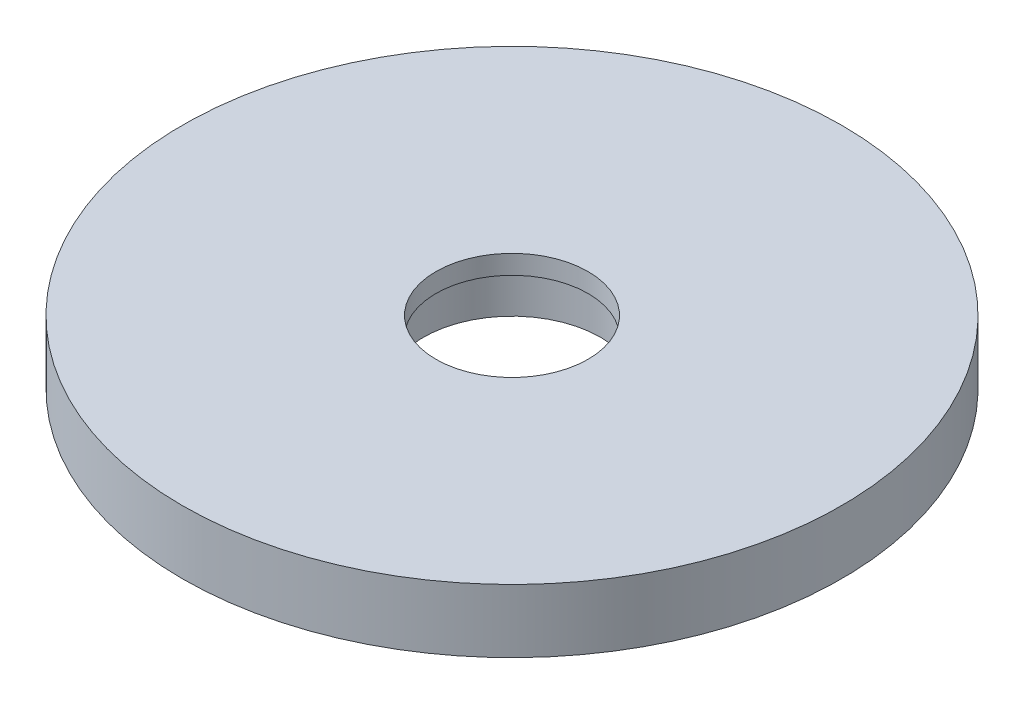
ISO-10303-21;
HEADER;
FILE_DESCRIPTION(('STEP AP214'),'2;1');
FILE_NAME('part.step','',(''),(''),'','','');
FILE_SCHEMA(('AUTOMOTIVE_DESIGN { 1 0 10303 214 1 1 1 1 }'));
ENDSEC;
DATA;
#1=APPLICATION_CONTEXT('core data for automotive mechanical design processes');
#2=APPLICATION_PROTOCOL_DEFINITION('international standard','automotive_design',2000,#1);
#3=PRODUCT_CONTEXT('',#1,'mechanical');
#4=PRODUCT('Part','Part','',(#3));
#5=PRODUCT_RELATED_PRODUCT_CATEGORY('part','',(#4));
#6=PRODUCT_DEFINITION_FORMATION('','',#4);
#7=PRODUCT_DEFINITION_CONTEXT('part definition',#1,'design');
#8=PRODUCT_DEFINITION('design','',#6,#7);
#9=PRODUCT_DEFINITION_SHAPE('','',#8);
#10=(LENGTH_UNIT() NAMED_UNIT(*) SI_UNIT(.MILLI.,.METRE.));
#11=(NAMED_UNIT(*) PLANE_ANGLE_UNIT() SI_UNIT($,.RADIAN.));
#12=(NAMED_UNIT(*) SI_UNIT($,.STERADIAN.) SOLID_ANGLE_UNIT());
#13=UNCERTAINTY_MEASURE_WITH_UNIT(LENGTH_MEASURE(1.E-05),#10,'distance_accuracy_value','');
#14=(GEOMETRIC_REPRESENTATION_CONTEXT(3) GLOBAL_UNCERTAINTY_ASSIGNED_CONTEXT((#13)) GLOBAL_UNIT_ASSIGNED_CONTEXT((#10,
#11,#12)) REPRESENTATION_CONTEXT('',''));
#15=CARTESIAN_POINT('',(0.,0.,0.));
#16=DIRECTION('',(0.,0.,1.));
#17=DIRECTION('',(1.,0.,0.));
#18=AXIS2_PLACEMENT_3D('',#15,#16,#17);
#19=CARTESIAN_POINT('',(0.,10.,0.));
#20=DIRECTION('',(0.,-1.,0.));
#21=DIRECTION('',(0.,0.,-1.));
#22=AXIS2_PLACEMENT_3D('',#19,#20,#21);
#23=CYLINDRICAL_SURFACE('',#22,12.);
#24=CARTESIAN_POINT('',(0.,10.,0.));
#25=DIRECTION('',(0.,1.,0.));
#26=DIRECTION('',(0.,0.,1.));
#27=AXIS2_PLACEMENT_3D('',#24,#25,#26);
#28=CIRCLE('',#27,12.);
#29=CARTESIAN_POINT('',(0.,10.,12.));
#30=VERTEX_POINT('',#29);
#31=EDGE_CURVE('E55',#30,#30,#28,.T.);
#32=ORIENTED_EDGE('',*,*,#31,.T.);
#33=EDGE_LOOP('',(#32));
#34=FACE_BOUND('',#33,.T.);
#35=CARTESIAN_POINT('',(0.,7.,0.));
#36=DIRECTION('',(0.,-1.,0.));
#37=DIRECTION('',(0.,0.,-1.));
#38=AXIS2_PLACEMENT_3D('',#35,#36,#37);
#39=CIRCLE('',#38,12.);
#40=CARTESIAN_POINT('',(0.,7.,-12.));
#41=VERTEX_POINT('',#40);
#42=EDGE_CURVE('E38',#41,#41,#39,.T.);
#43=ORIENTED_EDGE('',*,*,#42,.T.);
#44=EDGE_LOOP('',(#43));
#45=FACE_BOUND('',#44,.T.);
#46=ADVANCED_FACE('F34',(#34,#45),#23,.F.);
#47=CARTESIAN_POINT('',(0.,10.,0.));
#48=DIRECTION('',(0.,-1.,0.));
#49=DIRECTION('',(0.,0.,-1.));
#50=AXIS2_PLACEMENT_3D('',#47,#48,#49);
#51=CYLINDRICAL_SURFACE('',#50,52.);
#52=CARTESIAN_POINT('',(0.,10.,0.));
#53=DIRECTION('',(0.,1.,0.));
#54=DIRECTION('',(0.,0.,1.));
#55=AXIS2_PLACEMENT_3D('',#52,#53,#54);
#56=CIRCLE('',#55,52.);
#57=CARTESIAN_POINT('',(0.,10.,52.));
#58=VERTEX_POINT('',#57);
#59=EDGE_CURVE('E42',#58,#58,#56,.T.);
#60=ORIENTED_EDGE('',*,*,#59,.F.);
#61=EDGE_LOOP('',(#60));
#62=FACE_BOUND('',#61,.T.);
#63=CARTESIAN_POINT('',(0.,0.,0.));
#64=DIRECTION('',(0.,1.,0.));
#65=DIRECTION('',(0.,0.,1.));
#66=AXIS2_PLACEMENT_3D('',#63,#64,#65);
#67=CIRCLE('',#66,52.);
#68=CARTESIAN_POINT('',(0.,0.,52.));
#69=VERTEX_POINT('',#68);
#70=EDGE_CURVE('E46',#69,#69,#67,.T.);
#71=ORIENTED_EDGE('',*,*,#70,.T.);
#72=EDGE_LOOP('',(#71));
#73=FACE_BOUND('',#72,.T.);
#74=ADVANCED_FACE('F36',(#62,#73),#51,.T.);
#75=CARTESIAN_POINT('',(0.,10.,0.));
#76=DIRECTION('',(0.,1.,0.));
#77=DIRECTION('',(0.,0.,1.));
#78=AXIS2_PLACEMENT_3D('',#75,#76,#77);
#79=PLANE('',#78);
#80=ORIENTED_EDGE('',*,*,#31,.F.);
#81=EDGE_LOOP('',(#80));
#82=FACE_BOUND('',#81,.T.);
#83=ORIENTED_EDGE('',*,*,#59,.T.);
#84=EDGE_LOOP('',(#83));
#85=FACE_BOUND('',#84,.T.);
#86=ADVANCED_FACE('F90',(#82,#85),#79,.T.);
#87=CARTESIAN_POINT('',(0.,0.,0.));
#88=DIRECTION('',(0.,1.,0.));
#89=DIRECTION('',(0.,0.,1.));
#90=AXIS2_PLACEMENT_3D('',#87,#88,#89);
#91=PLANE('',#90);
#92=CARTESIAN_POINT('',(0.,0.,0.));
#93=DIRECTION('',(0.,1.,0.));
#94=DIRECTION('',(0.,0.,1.));
#95=AXIS2_PLACEMENT_3D('',#92,#93,#94);
#96=CIRCLE('',#95,50.);
#97=CARTESIAN_POINT('',(0.,0.,50.));
#98=VERTEX_POINT('',#97);
#99=EDGE_CURVE('E52',#98,#98,#96,.T.);
#100=ORIENTED_EDGE('',*,*,#99,.T.);
#101=EDGE_LOOP('',(#100));
#102=FACE_BOUND('',#101,.T.);
#103=ORIENTED_EDGE('',*,*,#70,.F.);
#104=EDGE_LOOP('',(#103));
#105=FACE_BOUND('',#104,.T.);
#106=ADVANCED_FACE('F103',(#102,#105),#91,.F.);
#107=CARTESIAN_POINT('',(0.,5.,0.));
#108=DIRECTION('',(0.,-1.,0.));
#109=DIRECTION('',(0.,0.,-1.));
#110=AXIS2_PLACEMENT_3D('',#107,#108,#109);
#111=CYLINDRICAL_SURFACE('',#110,50.);
#112=CARTESIAN_POINT('',(0.,5.,0.));
#113=DIRECTION('',(0.,1.,0.));
#114=DIRECTION('',(0.,0.,1.));
#115=AXIS2_PLACEMENT_3D('',#112,#113,#114);
#116=CIRCLE('',#115,50.);
#117=CARTESIAN_POINT('',(0.,5.,50.));
#118=VERTEX_POINT('',#117);
#119=EDGE_CURVE('E50',#118,#118,#116,.T.);
#120=ORIENTED_EDGE('',*,*,#119,.T.);
#121=EDGE_LOOP('',(#120));
#122=FACE_BOUND('',#121,.T.);
#123=ORIENTED_EDGE('',*,*,#99,.F.);
#124=EDGE_LOOP('',(#123));
#125=FACE_BOUND('',#124,.T.);
#126=ADVANCED_FACE('F99',(#122,#125),#111,.F.);
#127=CARTESIAN_POINT('',(0.,5.,0.));
#128=DIRECTION('',(0.,1.,0.));
#129=DIRECTION('',(0.,0.,1.));
#130=AXIS2_PLACEMENT_3D('',#127,#128,#129);
#131=PLANE('',#130);
#132=CARTESIAN_POINT('',(0.,5.,0.));
#133=DIRECTION('',(0.,1.,0.));
#134=DIRECTION('',(0.,0.,1.));
#135=AXIS2_PLACEMENT_3D('',#132,#133,#134);
#136=CIRCLE('',#135,17.);
#137=CARTESIAN_POINT('',(0.,5.,17.));
#138=VERTEX_POINT('',#137);
#139=EDGE_CURVE('E10',#138,#138,#136,.F.);
#140=ORIENTED_EDGE('',*,*,#139,.F.);
#141=EDGE_LOOP('',(#140));
#142=FACE_BOUND('',#141,.T.);
#143=ORIENTED_EDGE('',*,*,#119,.F.);
#144=EDGE_LOOP('',(#143));
#145=FACE_BOUND('',#144,.T.);
#146=ADVANCED_FACE('F96',(#142,#145),#131,.F.);
#147=CARTESIAN_POINT('',(0.,0.,0.));
#148=DIRECTION('',(0.,1.,0.));
#149=DIRECTION('',(0.,0.,1.));
#150=AXIS2_PLACEMENT_3D('',#147,#148,#149);
#151=CYLINDRICAL_SURFACE('',#150,17.);
#152=CARTESIAN_POINT('',(0.,0.,0.));
#153=DIRECTION('',(0.,-1.,0.));
#154=DIRECTION('',(0.,0.,-1.));
#155=AXIS2_PLACEMENT_3D('',#152,#153,#154);
#156=CIRCLE('',#155,17.);
#157=CARTESIAN_POINT('',(0.,0.,-17.));
#158=VERTEX_POINT('',#157);
#159=EDGE_CURVE('E60',#158,#158,#156,.T.);
#160=ORIENTED_EDGE('',*,*,#159,.F.);
#161=EDGE_LOOP('',(#160));
#162=FACE_BOUND('',#161,.T.);
#163=ORIENTED_EDGE('',*,*,#139,.T.);
#164=EDGE_LOOP('',(#163));
#165=FACE_BOUND('',#164,.T.);
#166=ADVANCED_FACE('F94',(#162,#165),#151,.T.);
#167=CARTESIAN_POINT('',(0.,0.,0.));
#168=DIRECTION('',(0.,-1.,0.));
#169=DIRECTION('',(0.,0.,-1.));
#170=AXIS2_PLACEMENT_3D('',#167,#168,#169);
#171=PLANE('',#170);
#172=CARTESIAN_POINT('',(0.,0.,0.));
#173=DIRECTION('',(0.,-1.,0.));
#174=DIRECTION('',(0.,0.,-1.));
#175=AXIS2_PLACEMENT_3D('',#172,#173,#174);
#176=CIRCLE('',#175,14.);
#177=CARTESIAN_POINT('',(0.,0.,-14.));
#178=VERTEX_POINT('',#177);
#179=EDGE_CURVE('E63',#178,#178,#176,.T.);
#180=ORIENTED_EDGE('',*,*,#179,.F.);
#181=EDGE_LOOP('',(#180));
#182=FACE_BOUND('',#181,.T.);
#183=ORIENTED_EDGE('',*,*,#159,.T.);
#184=EDGE_LOOP('',(#183));
#185=FACE_BOUND('',#184,.T.);
#186=ADVANCED_FACE('F81',(#182,#185),#171,.T.);
#187=CARTESIAN_POINT('',(0.,7.,0.));
#188=DIRECTION('',(0.,-1.,0.));
#189=DIRECTION('',(0.,0.,-1.));
#190=AXIS2_PLACEMENT_3D('',#187,#188,#189);
#191=CYLINDRICAL_SURFACE('',#190,14.);
#192=CARTESIAN_POINT('',(0.,7.,0.));
#193=DIRECTION('',(0.,-1.,0.));
#194=DIRECTION('',(0.,0.,-1.));
#195=AXIS2_PLACEMENT_3D('',#192,#193,#194);
#196=CIRCLE('',#195,14.);
#197=CARTESIAN_POINT('',(0.,7.,-14.));
#198=VERTEX_POINT('',#197);
#199=EDGE_CURVE('E66',#198,#198,#196,.T.);
#200=ORIENTED_EDGE('',*,*,#199,.F.);
#201=EDGE_LOOP('',(#200));
#202=FACE_BOUND('',#201,.T.);
#203=ORIENTED_EDGE('',*,*,#179,.T.);
#204=EDGE_LOOP('',(#203));
#205=FACE_BOUND('',#204,.T.);
#206=ADVANCED_FACE('F76',(#202,#205),#191,.F.);
#207=CARTESIAN_POINT('',(0.,7.,0.));
#208=DIRECTION('',(0.,-1.,0.));
#209=DIRECTION('',(0.,0.,-1.));
#210=AXIS2_PLACEMENT_3D('',#207,#208,#209);
#211=PLANE('',#210);
#212=ORIENTED_EDGE('',*,*,#42,.F.);
#213=EDGE_LOOP('',(#212));
#214=FACE_BOUND('',#213,.T.);
#215=ORIENTED_EDGE('',*,*,#199,.T.);
#216=EDGE_LOOP('',(#215));
#217=FACE_BOUND('',#216,.T.);
#218=ADVANCED_FACE('F74',(#214,#217),#211,.T.);
#219=CLOSED_SHELL('',(#46,#74,#86,#106,#126,#146,#166,#186,#206,#218));
#220=MANIFOLD_SOLID_BREP('B2',#219);
#221=ADVANCED_BREP_SHAPE_REPRESENTATION('',(#18,#220),#14);
#222=SHAPE_DEFINITION_REPRESENTATION(#9,#221);
ENDSEC;
END-ISO-10303-21;
